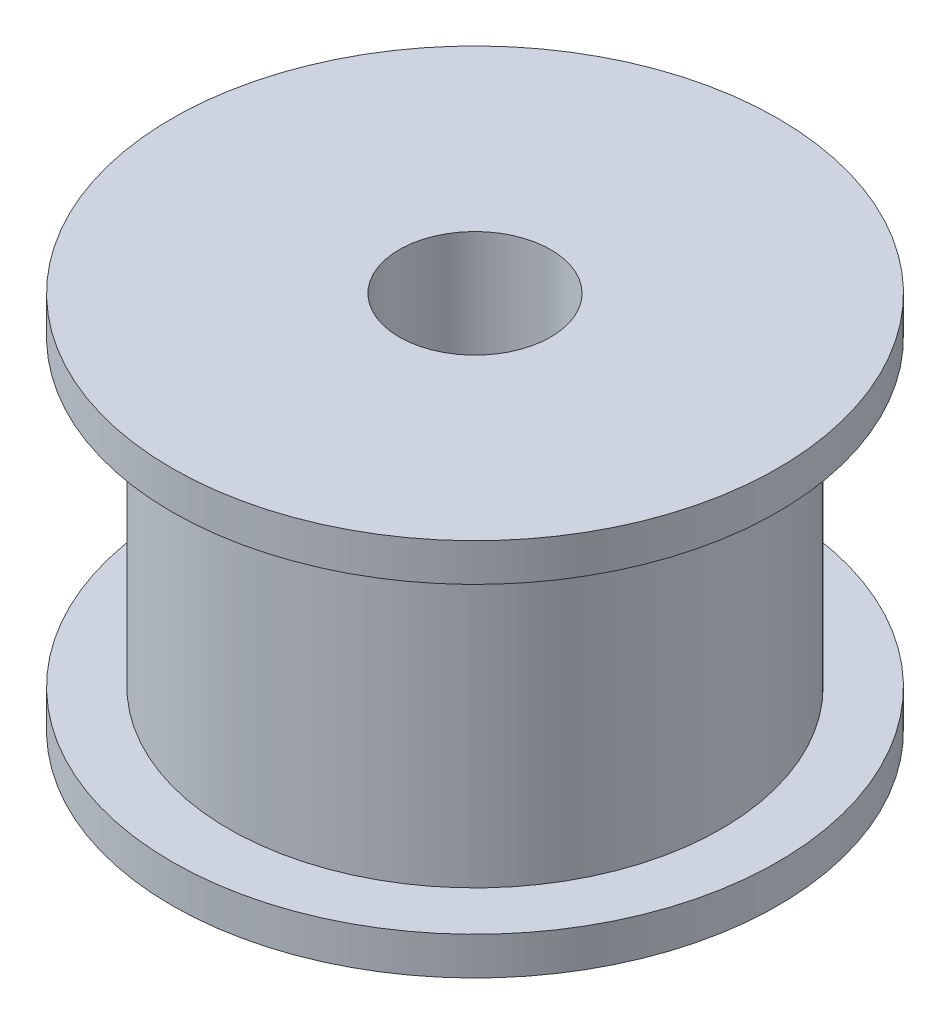
ISO-10303-21;
HEADER;
FILE_DESCRIPTION(('STEP AP214'),'2;1');
FILE_NAME('part.step','',(''),(''),'','','');
FILE_SCHEMA(('AUTOMOTIVE_DESIGN { 1 0 10303 214 1 1 1 1 }'));
ENDSEC;
DATA;
#1=APPLICATION_CONTEXT('core data for automotive mechanical design processes');
#2=APPLICATION_PROTOCOL_DEFINITION('international standard','automotive_design',2000,#1);
#3=PRODUCT_CONTEXT('',#1,'mechanical');
#4=PRODUCT('Part','Part','',(#3));
#5=PRODUCT_RELATED_PRODUCT_CATEGORY('part','',(#4));
#6=PRODUCT_DEFINITION_FORMATION('','',#4);
#7=PRODUCT_DEFINITION_CONTEXT('part definition',#1,'design');
#8=PRODUCT_DEFINITION('design','',#6,#7);
#9=PRODUCT_DEFINITION_SHAPE('','',#8);
#10=(LENGTH_UNIT() NAMED_UNIT(*) SI_UNIT(.MILLI.,.METRE.));
#11=(NAMED_UNIT(*) PLANE_ANGLE_UNIT() SI_UNIT($,.RADIAN.));
#12=(NAMED_UNIT(*) SI_UNIT($,.STERADIAN.) SOLID_ANGLE_UNIT());
#13=UNCERTAINTY_MEASURE_WITH_UNIT(LENGTH_MEASURE(1.E-05),#10,'distance_accuracy_value','');
#14=(GEOMETRIC_REPRESENTATION_CONTEXT(3) GLOBAL_UNCERTAINTY_ASSIGNED_CONTEXT((#13)) GLOBAL_UNIT_ASSIGNED_CONTEXT((#10,
#11,#12)) REPRESENTATION_CONTEXT('',''));
#15=CARTESIAN_POINT('',(0.,0.,0.));
#16=DIRECTION('',(0.,0.,1.));
#17=DIRECTION('',(1.,0.,0.));
#18=AXIS2_PLACEMENT_3D('',#15,#16,#17);
#19=CARTESIAN_POINT('',(0.,0.,0.));
#20=DIRECTION('',(0.,-1.,0.));
#21=DIRECTION('',(0.,0.,-1.));
#22=AXIS2_PLACEMENT_3D('',#19,#20,#21);
#23=CYLINDRICAL_SURFACE('',#22,8.);
#24=CARTESIAN_POINT('',(0.,9.,0.));
#25=DIRECTION('',(0.,-1.,0.));
#26=DIRECTION('',(0.,0.,-1.));
#27=AXIS2_PLACEMENT_3D('',#24,#25,#26);
#28=CIRCLE('',#27,8.);
#29=CARTESIAN_POINT('',(0.,9.,-8.));
#30=VERTEX_POINT('',#29);
#31=EDGE_CURVE('E74',#30,#30,#28,.T.);
#32=ORIENTED_EDGE('',*,*,#31,.T.);
#33=EDGE_LOOP('',(#32));
#34=FACE_BOUND('',#33,.T.);
#35=CARTESIAN_POINT('',(0.,8.,0.));
#36=DIRECTION('',(0.,-1.,0.));
#37=DIRECTION('',(0.,0.,-1.));
#38=AXIS2_PLACEMENT_3D('',#35,#36,#37);
#39=CIRCLE('',#38,8.);
#40=CARTESIAN_POINT('',(0.,8.,-8.));
#41=VERTEX_POINT('',#40);
#42=EDGE_CURVE('E10',#41,#41,#39,.T.);
#43=ORIENTED_EDGE('',*,*,#42,.F.);
#44=EDGE_LOOP('',(#43));
#45=FACE_BOUND('',#44,.T.);
#46=ADVANCED_FACE('F47',(#34,#45),#23,.T.);
#47=CARTESIAN_POINT('',(0.,8.,0.));
#48=DIRECTION('',(0.,-1.,0.));
#49=DIRECTION('',(0.,0.,-1.));
#50=AXIS2_PLACEMENT_3D('',#47,#48,#49);
#51=PLANE('',#50);
#52=ORIENTED_EDGE('',*,*,#42,.T.);
#53=EDGE_LOOP('',(#52));
#54=FACE_BOUND('',#53,.T.);
#55=CARTESIAN_POINT('',(0.,8.,0.));
#56=DIRECTION('',(0.,-1.,0.));
#57=DIRECTION('',(0.,0.,-1.));
#58=AXIS2_PLACEMENT_3D('',#55,#56,#57);
#59=CIRCLE('',#58,6.5);
#60=CARTESIAN_POINT('',(0.,8.,-6.5));
#61=VERTEX_POINT('',#60);
#62=EDGE_CURVE('E54',#61,#61,#59,.T.);
#63=ORIENTED_EDGE('',*,*,#62,.F.);
#64=EDGE_LOOP('',(#63));
#65=FACE_BOUND('',#64,.T.);
#66=ADVANCED_FACE('F104',(#54,#65),#51,.T.);
#67=CARTESIAN_POINT('',(0.,0.,0.));
#68=DIRECTION('',(0.,-1.,0.));
#69=DIRECTION('',(0.,0.,-1.));
#70=AXIS2_PLACEMENT_3D('',#67,#68,#69);
#71=CYLINDRICAL_SURFACE('',#70,6.5);
#72=ORIENTED_EDGE('',*,*,#62,.T.);
#73=EDGE_LOOP('',(#72));
#74=FACE_BOUND('',#73,.T.);
#75=CARTESIAN_POINT('',(0.,0.,0.));
#76=DIRECTION('',(0.,-1.,0.));
#77=DIRECTION('',(0.,0.,-1.));
#78=AXIS2_PLACEMENT_3D('',#75,#76,#77);
#79=CIRCLE('',#78,6.5);
#80=CARTESIAN_POINT('',(0.,0.,-6.5));
#81=VERTEX_POINT('',#80);
#82=EDGE_CURVE('E59',#81,#81,#79,.T.);
#83=ORIENTED_EDGE('',*,*,#82,.F.);
#84=EDGE_LOOP('',(#83));
#85=FACE_BOUND('',#84,.T.);
#86=ADVANCED_FACE('F108',(#74,#85),#71,.T.);
#87=CARTESIAN_POINT('',(0.,0.,0.));
#88=DIRECTION('',(0.,-1.,0.));
#89=DIRECTION('',(0.,0.,-1.));
#90=AXIS2_PLACEMENT_3D('',#87,#88,#89);
#91=PLANE('',#90);
#92=CARTESIAN_POINT('',(0.,0.,0.));
#93=DIRECTION('',(0.,-1.,0.));
#94=DIRECTION('',(0.,0.,-1.));
#95=AXIS2_PLACEMENT_3D('',#92,#93,#94);
#96=CIRCLE('',#95,8.);
#97=CARTESIAN_POINT('',(0.,0.,-8.));
#98=VERTEX_POINT('',#97);
#99=EDGE_CURVE('E64',#98,#98,#96,.T.);
#100=ORIENTED_EDGE('',*,*,#99,.F.);
#101=EDGE_LOOP('',(#100));
#102=FACE_BOUND('',#101,.T.);
#103=ORIENTED_EDGE('',*,*,#82,.T.);
#104=EDGE_LOOP('',(#103));
#105=FACE_BOUND('',#104,.T.);
#106=ADVANCED_FACE('F112',(#102,#105),#91,.F.);
#107=CARTESIAN_POINT('',(0.,0.,0.));
#108=DIRECTION('',(0.,-1.,0.));
#109=DIRECTION('',(0.,0.,-1.));
#110=AXIS2_PLACEMENT_3D('',#107,#108,#109);
#111=CYLINDRICAL_SURFACE('',#110,8.);
#112=CARTESIAN_POINT('',(0.,-1.,0.));
#113=DIRECTION('',(0.,-1.,0.));
#114=DIRECTION('',(0.,0.,-1.));
#115=AXIS2_PLACEMENT_3D('',#112,#113,#114);
#116=CIRCLE('',#115,8.);
#117=CARTESIAN_POINT('',(0.,-1.,-8.));
#118=VERTEX_POINT('',#117);
#119=EDGE_CURVE('E70',#118,#118,#116,.T.);
#120=ORIENTED_EDGE('',*,*,#119,.F.);
#121=EDGE_LOOP('',(#120));
#122=FACE_BOUND('',#121,.T.);
#123=ORIENTED_EDGE('',*,*,#99,.T.);
#124=EDGE_LOOP('',(#123));
#125=FACE_BOUND('',#124,.T.);
#126=ADVANCED_FACE('F118',(#122,#125),#111,.T.);
#127=CARTESIAN_POINT('',(0.,-1.,0.));
#128=DIRECTION('',(0.,-1.,0.));
#129=DIRECTION('',(0.,0.,-1.));
#130=AXIS2_PLACEMENT_3D('',#127,#128,#129);
#131=PLANE('',#130);
#132=CARTESIAN_POINT('',(0.,-0.999999999999999,0.));
#133=DIRECTION('',(0.,1.,0.));
#134=DIRECTION('',(0.,0.,1.));
#135=AXIS2_PLACEMENT_3D('',#132,#133,#134);
#136=CIRCLE('',#135,2.);
#137=CARTESIAN_POINT('',(0.,-0.999999999999999,2.));
#138=VERTEX_POINT('',#137);
#139=EDGE_CURVE('E78',#138,#138,#136,.T.);
#140=ORIENTED_EDGE('',*,*,#139,.T.);
#141=EDGE_LOOP('',(#140));
#142=FACE_BOUND('',#141,.T.);
#143=ORIENTED_EDGE('',*,*,#119,.T.);
#144=EDGE_LOOP('',(#143));
#145=FACE_BOUND('',#144,.T.);
#146=ADVANCED_FACE('F87',(#142,#145),#131,.T.);
#147=CARTESIAN_POINT('',(0.,9.,0.));
#148=DIRECTION('',(0.,-1.,0.));
#149=DIRECTION('',(0.,0.,-1.));
#150=AXIS2_PLACEMENT_3D('',#147,#148,#149);
#151=PLANE('',#150);
#152=CARTESIAN_POINT('',(0.,9.,0.));
#153=DIRECTION('',(0.,1.,0.));
#154=DIRECTION('',(0.,0.,1.));
#155=AXIS2_PLACEMENT_3D('',#152,#153,#154);
#156=CIRCLE('',#155,2.);
#157=CARTESIAN_POINT('',(0.,9.,2.));
#158=VERTEX_POINT('',#157);
#159=EDGE_CURVE('E79',#158,#158,#156,.T.);
#160=ORIENTED_EDGE('',*,*,#159,.F.);
#161=EDGE_LOOP('',(#160));
#162=FACE_BOUND('',#161,.T.);
#163=ORIENTED_EDGE('',*,*,#31,.F.);
#164=EDGE_LOOP('',(#163));
#165=FACE_BOUND('',#164,.T.);
#166=ADVANCED_FACE('F93',(#162,#165),#151,.F.);
#167=CARTESIAN_POINT('',(0.,-0.999999999999999,0.));
#168=DIRECTION('',(0.,1.,0.));
#169=DIRECTION('',(0.,0.,1.));
#170=AXIS2_PLACEMENT_3D('',#167,#168,#169);
#171=CYLINDRICAL_SURFACE('',#170,2.);
#172=ORIENTED_EDGE('',*,*,#139,.F.);
#173=EDGE_LOOP('',(#172));
#174=FACE_BOUND('',#173,.T.);
#175=ORIENTED_EDGE('',*,*,#159,.T.);
#176=EDGE_LOOP('',(#175));
#177=FACE_BOUND('',#176,.T.);
#178=ADVANCED_FACE('F90',(#174,#177),#171,.F.);
#179=CLOSED_SHELL('',(#46,#66,#86,#106,#126,#146,#166,#178));
#180=MANIFOLD_SOLID_BREP('B2',#179);
#181=ADVANCED_BREP_SHAPE_REPRESENTATION('',(#18,#180),#14);
#182=SHAPE_DEFINITION_REPRESENTATION(#9,#181);
ENDSEC;
END-ISO-10303-21;
